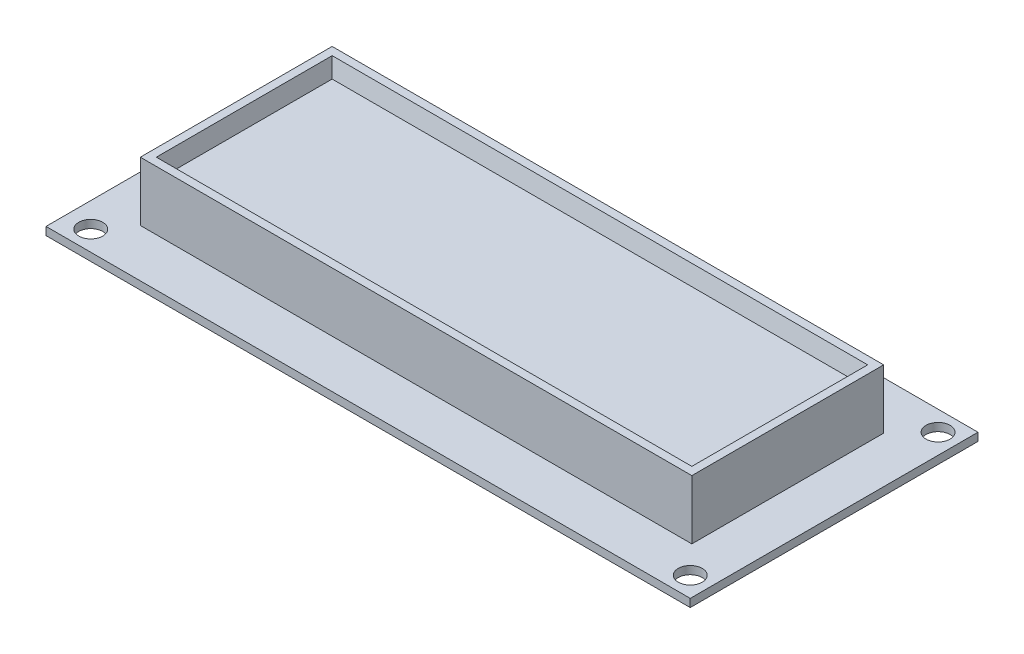
ISO-10303-21;
HEADER;
FILE_DESCRIPTION(('STEP AP214'),'2;1');
FILE_NAME('part.step','',(''),(''),'','','');
FILE_SCHEMA(('AUTOMOTIVE_DESIGN { 1 0 10303 214 1 1 1 1 }'));
ENDSEC;
DATA;
#1=APPLICATION_CONTEXT('core data for automotive mechanical design processes');
#2=APPLICATION_PROTOCOL_DEFINITION('international standard','automotive_design',2000,#1);
#3=PRODUCT_CONTEXT('',#1,'mechanical');
#4=PRODUCT('Part','Part','',(#3));
#5=PRODUCT_RELATED_PRODUCT_CATEGORY('part','',(#4));
#6=PRODUCT_DEFINITION_FORMATION('','',#4);
#7=PRODUCT_DEFINITION_CONTEXT('part definition',#1,'design');
#8=PRODUCT_DEFINITION('design','',#6,#7);
#9=PRODUCT_DEFINITION_SHAPE('','',#8);
#10=(LENGTH_UNIT() NAMED_UNIT(*) SI_UNIT(.MILLI.,.METRE.));
#11=(NAMED_UNIT(*) PLANE_ANGLE_UNIT() SI_UNIT($,.RADIAN.));
#12=(NAMED_UNIT(*) SI_UNIT($,.STERADIAN.) SOLID_ANGLE_UNIT());
#13=UNCERTAINTY_MEASURE_WITH_UNIT(LENGTH_MEASURE(1.E-05),#10,'distance_accuracy_value','');
#14=(GEOMETRIC_REPRESENTATION_CONTEXT(3) GLOBAL_UNCERTAINTY_ASSIGNED_CONTEXT((#13)) GLOBAL_UNIT_ASSIGNED_CONTEXT((#10,
#11,#12)) REPRESENTATION_CONTEXT('',''));
#15=CARTESIAN_POINT('',(0.,0.,0.));
#16=DIRECTION('',(0.,0.,1.));
#17=DIRECTION('',(1.,0.,0.));
#18=AXIS2_PLACEMENT_3D('',#15,#16,#17);
#19=CARTESIAN_POINT('',(0.,1.,0.));
#20=DIRECTION('',(0.,-1.,0.));
#21=DIRECTION('',(0.,0.,-1.));
#22=AXIS2_PLACEMENT_3D('',#19,#20,#21);
#23=PLANE('',#22);
#24=CARTESIAN_POINT('',(78.1,1.,-33.5));
#25=DIRECTION('',(0.,1.,0.));
#26=DIRECTION('',(0.,0.,1.));
#27=AXIS2_PLACEMENT_3D('',#24,#25,#26);
#28=CIRCLE('',#27,1.5);
#29=CARTESIAN_POINT('',(78.1,1.,-32.));
#30=VERTEX_POINT('',#29);
#31=EDGE_CURVE('E155',#30,#30,#28,.T.);
#32=ORIENTED_EDGE('',*,*,#31,.F.);
#33=EDGE_LOOP('',(#32));
#34=FACE_BOUND('',#33,.T.);
#35=CARTESIAN_POINT('',(78.1,1.,-2.5));
#36=DIRECTION('',(0.,1.,0.));
#37=DIRECTION('',(0.,0.,1.));
#38=AXIS2_PLACEMENT_3D('',#35,#36,#37);
#39=CIRCLE('',#38,1.5);
#40=CARTESIAN_POINT('',(78.1,1.,-0.999999999999998));
#41=VERTEX_POINT('',#40);
#42=EDGE_CURVE('E170',#41,#41,#39,.T.);
#43=ORIENTED_EDGE('',*,*,#42,.F.);
#44=EDGE_LOOP('',(#43));
#45=FACE_BOUND('',#44,.T.);
#46=CARTESIAN_POINT('',(3.09999999999999,1.,-2.5));
#47=DIRECTION('',(0.,1.,0.));
#48=DIRECTION('',(0.,0.,1.));
#49=AXIS2_PLACEMENT_3D('',#46,#47,#48);
#50=CIRCLE('',#49,1.5);
#51=CARTESIAN_POINT('',(3.09999999999999,1.,-0.999999999999996));
#52=VERTEX_POINT('',#51);
#53=EDGE_CURVE('E166',#52,#52,#50,.T.);
#54=ORIENTED_EDGE('',*,*,#53,.F.);
#55=EDGE_LOOP('',(#54));
#56=FACE_BOUND('',#55,.T.);
#57=CARTESIAN_POINT('',(3.09999999999999,1.,-33.5));
#58=DIRECTION('',(0.,1.,0.));
#59=DIRECTION('',(0.,0.,1.));
#60=AXIS2_PLACEMENT_3D('',#57,#58,#59);
#61=CIRCLE('',#60,1.5);
#62=CARTESIAN_POINT('',(3.09999999999999,1.,-32.));
#63=VERTEX_POINT('',#62);
#64=EDGE_CURVE('E169',#63,#63,#61,.T.);
#65=ORIENTED_EDGE('',*,*,#64,.F.);
#66=EDGE_LOOP('',(#65));
#67=FACE_BOUND('',#66,.T.);
#68=DIRECTION('',(0.,0.,1.));
#69=VECTOR('',#68,1.);
#70=CARTESIAN_POINT('',(0.,1.,0.));
#71=LINE('',#70,#69);
#72=CARTESIAN_POINT('',(0.,1.,-36.));
#73=VERTEX_POINT('',#72);
#74=CARTESIAN_POINT('',(0.,1.,0.));
#75=VERTEX_POINT('',#74);
#76=EDGE_CURVE('E209',#73,#75,#71,.T.);
#77=ORIENTED_EDGE('',*,*,#76,.T.);
#78=DIRECTION('',(1.,0.,0.));
#79=VECTOR('',#78,1.);
#80=CARTESIAN_POINT('',(0.,1.,0.));
#81=LINE('',#80,#79);
#82=CARTESIAN_POINT('',(80.6,1.,0.));
#83=VERTEX_POINT('',#82);
#84=EDGE_CURVE('E212',#75,#83,#81,.T.);
#85=ORIENTED_EDGE('',*,*,#84,.T.);
#86=DIRECTION('',(0.,0.,-1.));
#87=VECTOR('',#86,1.);
#88=CARTESIAN_POINT('',(80.6,1.,0.));
#89=LINE('',#88,#87);
#90=CARTESIAN_POINT('',(80.6,1.,-36.));
#91=VERTEX_POINT('',#90);
#92=EDGE_CURVE('E215',#83,#91,#89,.T.);
#93=ORIENTED_EDGE('',*,*,#92,.T.);
#94=DIRECTION('',(-1.,0.,0.));
#95=VECTOR('',#94,1.);
#96=CARTESIAN_POINT('',(0.,1.,-36.));
#97=LINE('',#96,#95);
#98=EDGE_CURVE('E217',#91,#73,#97,.T.);
#99=ORIENTED_EDGE('',*,*,#98,.T.);
#100=EDGE_LOOP('',(#77,#85,#93,#99));
#101=FACE_BOUND('',#100,.T.);
#102=DIRECTION('',(0.,0.,1.));
#103=VECTOR('',#102,1.);
#104=CARTESIAN_POINT('',(5.8,1.,-6.));
#105=LINE('',#104,#103);
#106=CARTESIAN_POINT('',(5.8,1.,-30.));
#107=VERTEX_POINT('',#106);
#108=CARTESIAN_POINT('',(5.8,1.,-6.));
#109=VERTEX_POINT('',#108);
#110=EDGE_CURVE('E59',#107,#109,#105,.T.);
#111=ORIENTED_EDGE('',*,*,#110,.F.);
#112=DIRECTION('',(-1.,0.,0.));
#113=VECTOR('',#112,1.);
#114=CARTESIAN_POINT('',(5.8,1.,-30.));
#115=LINE('',#114,#113);
#116=CARTESIAN_POINT('',(74.8,1.,-30.));
#117=VERTEX_POINT('',#116);
#118=EDGE_CURVE('E182',#117,#107,#115,.T.);
#119=ORIENTED_EDGE('',*,*,#118,.F.);
#120=DIRECTION('',(0.,0.,-1.));
#121=VECTOR('',#120,1.);
#122=CARTESIAN_POINT('',(74.8,1.,-6.));
#123=LINE('',#122,#121);
#124=CARTESIAN_POINT('',(74.8,1.,-6.));
#125=VERTEX_POINT('',#124);
#126=EDGE_CURVE('E193',#125,#117,#123,.T.);
#127=ORIENTED_EDGE('',*,*,#126,.F.);
#128=DIRECTION('',(1.,0.,0.));
#129=VECTOR('',#128,1.);
#130=CARTESIAN_POINT('',(5.8,1.,-6.));
#131=LINE('',#130,#129);
#132=EDGE_CURVE('E190',#109,#125,#131,.T.);
#133=ORIENTED_EDGE('',*,*,#132,.F.);
#134=EDGE_LOOP('',(#111,#119,#127,#133));
#135=FACE_BOUND('',#134,.T.);
#136=ADVANCED_FACE('F34',(#34,#45,#56,#67,#101,#135),#23,.F.);
#137=CARTESIAN_POINT('',(0.,1.,0.));
#138=DIRECTION('',(1.,0.,0.));
#139=DIRECTION('',(0.,0.,-1.));
#140=AXIS2_PLACEMENT_3D('',#137,#138,#139);
#141=PLANE('',#140);
#142=DIRECTION('',(0.,0.,1.));
#143=VECTOR('',#142,1.);
#144=CARTESIAN_POINT('',(0.,0.,0.));
#145=LINE('',#144,#143);
#146=CARTESIAN_POINT('',(0.,0.,-36.));
#147=VERTEX_POINT('',#146);
#148=CARTESIAN_POINT('',(0.,0.,0.));
#149=VERTEX_POINT('',#148);
#150=EDGE_CURVE('E208',#147,#149,#145,.T.);
#151=ORIENTED_EDGE('',*,*,#150,.T.);
#152=DIRECTION('',(0.,-1.,0.));
#153=VECTOR('',#152,1.);
#154=CARTESIAN_POINT('',(0.,1.,0.));
#155=LINE('',#154,#153);
#156=EDGE_CURVE('E11',#75,#149,#155,.T.);
#157=ORIENTED_EDGE('',*,*,#156,.F.);
#158=ORIENTED_EDGE('',*,*,#76,.F.);
#159=DIRECTION('',(0.,-1.,0.));
#160=VECTOR('',#159,1.);
#161=CARTESIAN_POINT('',(0.,1.,-36.));
#162=LINE('',#161,#160);
#163=EDGE_CURVE('E219',#73,#147,#162,.T.);
#164=ORIENTED_EDGE('',*,*,#163,.T.);
#165=EDGE_LOOP('',(#151,#157,#158,#164));
#166=FACE_BOUND('',#165,.T.);
#167=ADVANCED_FACE('F36',(#166),#141,.F.);
#168=CARTESIAN_POINT('',(0.,1.,0.));
#169=DIRECTION('',(0.,0.,-1.));
#170=DIRECTION('',(-1.,0.,0.));
#171=AXIS2_PLACEMENT_3D('',#168,#169,#170);
#172=PLANE('',#171);
#173=DIRECTION('',(1.,0.,0.));
#174=VECTOR('',#173,1.);
#175=CARTESIAN_POINT('',(0.,0.,0.));
#176=LINE('',#175,#174);
#177=CARTESIAN_POINT('',(80.6,0.,0.));
#178=VERTEX_POINT('',#177);
#179=EDGE_CURVE('E222',#149,#178,#176,.T.);
#180=ORIENTED_EDGE('',*,*,#179,.T.);
#181=DIRECTION('',(0.,-1.,0.));
#182=VECTOR('',#181,1.);
#183=CARTESIAN_POINT('',(80.6,1.,0.));
#184=LINE('',#183,#182);
#185=EDGE_CURVE('E43',#83,#178,#184,.T.);
#186=ORIENTED_EDGE('',*,*,#185,.F.);
#187=ORIENTED_EDGE('',*,*,#84,.F.);
#188=ORIENTED_EDGE('',*,*,#156,.T.);
#189=EDGE_LOOP('',(#180,#186,#187,#188));
#190=FACE_BOUND('',#189,.T.);
#191=ADVANCED_FACE('F274',(#190),#172,.F.);
#192=CARTESIAN_POINT('',(80.6,1.,0.));
#193=DIRECTION('',(-1.,0.,0.));
#194=DIRECTION('',(0.,0.,1.));
#195=AXIS2_PLACEMENT_3D('',#192,#193,#194);
#196=PLANE('',#195);
#197=DIRECTION('',(0.,0.,-1.));
#198=VECTOR('',#197,1.);
#199=CARTESIAN_POINT('',(80.6,0.,0.));
#200=LINE('',#199,#198);
#201=CARTESIAN_POINT('',(80.6,0.,-36.));
#202=VERTEX_POINT('',#201);
#203=EDGE_CURVE('E224',#178,#202,#200,.T.);
#204=ORIENTED_EDGE('',*,*,#203,.T.);
#205=DIRECTION('',(0.,-1.,0.));
#206=VECTOR('',#205,1.);
#207=CARTESIAN_POINT('',(80.6,1.,-36.));
#208=LINE('',#207,#206);
#209=EDGE_CURVE('E229',#91,#202,#208,.T.);
#210=ORIENTED_EDGE('',*,*,#209,.F.);
#211=ORIENTED_EDGE('',*,*,#92,.F.);
#212=ORIENTED_EDGE('',*,*,#185,.T.);
#213=EDGE_LOOP('',(#204,#210,#211,#212));
#214=FACE_BOUND('',#213,.T.);
#215=ADVANCED_FACE('F271',(#214),#196,.F.);
#216=CARTESIAN_POINT('',(0.,1.,-36.));
#217=DIRECTION('',(0.,0.,1.));
#218=DIRECTION('',(1.,0.,0.));
#219=AXIS2_PLACEMENT_3D('',#216,#217,#218);
#220=PLANE('',#219);
#221=DIRECTION('',(-1.,0.,0.));
#222=VECTOR('',#221,1.);
#223=CARTESIAN_POINT('',(0.,0.,-36.));
#224=LINE('',#223,#222);
#225=EDGE_CURVE('E213',#202,#147,#224,.T.);
#226=ORIENTED_EDGE('',*,*,#225,.T.);
#227=ORIENTED_EDGE('',*,*,#163,.F.);
#228=ORIENTED_EDGE('',*,*,#98,.F.);
#229=ORIENTED_EDGE('',*,*,#209,.T.);
#230=EDGE_LOOP('',(#226,#227,#228,#229));
#231=FACE_BOUND('',#230,.T.);
#232=ADVANCED_FACE('F252',(#231),#220,.F.);
#233=CARTESIAN_POINT('',(0.,0.,0.));
#234=DIRECTION('',(0.,-1.,0.));
#235=DIRECTION('',(0.,0.,-1.));
#236=AXIS2_PLACEMENT_3D('',#233,#234,#235);
#237=PLANE('',#236);
#238=CARTESIAN_POINT('',(78.1,0.,-33.5));
#239=DIRECTION('',(0.,-1.,0.));
#240=DIRECTION('',(0.,0.,-1.));
#241=AXIS2_PLACEMENT_3D('',#238,#239,#240);
#242=CIRCLE('',#241,1.5);
#243=CARTESIAN_POINT('',(78.1,0.,-35.));
#244=VERTEX_POINT('',#243);
#245=EDGE_CURVE('E38',#244,#244,#242,.T.);
#246=ORIENTED_EDGE('',*,*,#245,.F.);
#247=EDGE_LOOP('',(#246));
#248=FACE_BOUND('',#247,.T.);
#249=CARTESIAN_POINT('',(78.1,0.,-2.5));
#250=DIRECTION('',(0.,-1.,0.));
#251=DIRECTION('',(0.,0.,-1.));
#252=AXIS2_PLACEMENT_3D('',#249,#250,#251);
#253=CIRCLE('',#252,1.5);
#254=CARTESIAN_POINT('',(78.1,0.,-3.99999999999999));
#255=VERTEX_POINT('',#254);
#256=EDGE_CURVE('E238',#255,#255,#253,.T.);
#257=ORIENTED_EDGE('',*,*,#256,.F.);
#258=EDGE_LOOP('',(#257));
#259=FACE_BOUND('',#258,.T.);
#260=CARTESIAN_POINT('',(3.09999999999999,0.,-2.5));
#261=DIRECTION('',(0.,-1.,0.));
#262=DIRECTION('',(0.,0.,-1.));
#263=AXIS2_PLACEMENT_3D('',#260,#261,#262);
#264=CIRCLE('',#263,1.5);
#265=CARTESIAN_POINT('',(3.09999999999999,0.,-3.99999999999999));
#266=VERTEX_POINT('',#265);
#267=EDGE_CURVE('E236',#266,#266,#264,.T.);
#268=ORIENTED_EDGE('',*,*,#267,.F.);
#269=EDGE_LOOP('',(#268));
#270=FACE_BOUND('',#269,.T.);
#271=CARTESIAN_POINT('',(3.09999999999999,0.,-33.5));
#272=DIRECTION('',(0.,-1.,0.));
#273=DIRECTION('',(0.,0.,-1.));
#274=AXIS2_PLACEMENT_3D('',#271,#272,#273);
#275=CIRCLE('',#274,1.5);
#276=CARTESIAN_POINT('',(3.09999999999999,0.,-35.));
#277=VERTEX_POINT('',#276);
#278=EDGE_CURVE('E177',#277,#277,#275,.T.);
#279=ORIENTED_EDGE('',*,*,#278,.F.);
#280=EDGE_LOOP('',(#279));
#281=FACE_BOUND('',#280,.T.);
#282=ORIENTED_EDGE('',*,*,#150,.F.);
#283=ORIENTED_EDGE('',*,*,#225,.F.);
#284=ORIENTED_EDGE('',*,*,#203,.F.);
#285=ORIENTED_EDGE('',*,*,#179,.F.);
#286=EDGE_LOOP('',(#282,#283,#284,#285));
#287=FACE_BOUND('',#286,.T.);
#288=ADVANCED_FACE('F248',(#248,#259,#270,#281,#287),#237,.T.);
#289=CARTESIAN_POINT('',(5.8,8.4,-6.));
#290=DIRECTION('',(1.,0.,0.));
#291=DIRECTION('',(0.,0.,-1.));
#292=AXIS2_PLACEMENT_3D('',#289,#290,#291);
#293=PLANE('',#292);
#294=ORIENTED_EDGE('',*,*,#110,.T.);
#295=DIRECTION('',(0.,-1.,0.));
#296=VECTOR('',#295,1.);
#297=CARTESIAN_POINT('',(5.8,8.4,-6.));
#298=LINE('',#297,#296);
#299=CARTESIAN_POINT('',(5.8,8.4,-6.));
#300=VERTEX_POINT('',#299);
#301=EDGE_CURVE('E205',#300,#109,#298,.T.);
#302=ORIENTED_EDGE('',*,*,#301,.F.);
#303=DIRECTION('',(0.,0.,1.));
#304=VECTOR('',#303,1.);
#305=CARTESIAN_POINT('',(5.8,8.4,-6.));
#306=LINE('',#305,#304);
#307=CARTESIAN_POINT('',(5.8,8.4,-30.));
#308=VERTEX_POINT('',#307);
#309=EDGE_CURVE('E178',#308,#300,#306,.T.);
#310=ORIENTED_EDGE('',*,*,#309,.F.);
#311=DIRECTION('',(0.,-1.,0.));
#312=VECTOR('',#311,1.);
#313=CARTESIAN_POINT('',(5.8,8.4,-30.));
#314=LINE('',#313,#312);
#315=EDGE_CURVE('E188',#308,#107,#314,.T.);
#316=ORIENTED_EDGE('',*,*,#315,.T.);
#317=EDGE_LOOP('',(#294,#302,#310,#316));
#318=FACE_BOUND('',#317,.T.);
#319=ADVANCED_FACE('F251',(#318),#293,.F.);
#320=CARTESIAN_POINT('',(5.8,8.4,-6.));
#321=DIRECTION('',(0.,0.,-1.));
#322=DIRECTION('',(-1.,0.,0.));
#323=AXIS2_PLACEMENT_3D('',#320,#321,#322);
#324=PLANE('',#323);
#325=ORIENTED_EDGE('',*,*,#132,.T.);
#326=DIRECTION('',(0.,-1.,0.));
#327=VECTOR('',#326,1.);
#328=CARTESIAN_POINT('',(74.8,8.4,-6.));
#329=LINE('',#328,#327);
#330=CARTESIAN_POINT('',(74.8,8.4,-6.));
#331=VERTEX_POINT('',#330);
#332=EDGE_CURVE('E202',#331,#125,#329,.T.);
#333=ORIENTED_EDGE('',*,*,#332,.F.);
#334=DIRECTION('',(1.,0.,0.));
#335=VECTOR('',#334,1.);
#336=CARTESIAN_POINT('',(5.8,8.4,-6.));
#337=LINE('',#336,#335);
#338=EDGE_CURVE('E181',#300,#331,#337,.T.);
#339=ORIENTED_EDGE('',*,*,#338,.F.);
#340=ORIENTED_EDGE('',*,*,#301,.T.);
#341=EDGE_LOOP('',(#325,#333,#339,#340));
#342=FACE_BOUND('',#341,.T.);
#343=ADVANCED_FACE('F314',(#342),#324,.F.);
#344=CARTESIAN_POINT('',(74.8,8.4,-6.));
#345=DIRECTION('',(-1.,0.,0.));
#346=DIRECTION('',(0.,0.,1.));
#347=AXIS2_PLACEMENT_3D('',#344,#345,#346);
#348=PLANE('',#347);
#349=ORIENTED_EDGE('',*,*,#126,.T.);
#350=DIRECTION('',(0.,-1.,0.));
#351=VECTOR('',#350,1.);
#352=CARTESIAN_POINT('',(74.8,8.4,-30.));
#353=LINE('',#352,#351);
#354=CARTESIAN_POINT('',(74.8,8.4,-30.));
#355=VERTEX_POINT('',#354);
#356=EDGE_CURVE('E199',#355,#117,#353,.T.);
#357=ORIENTED_EDGE('',*,*,#356,.F.);
#358=DIRECTION('',(0.,0.,-1.));
#359=VECTOR('',#358,1.);
#360=CARTESIAN_POINT('',(74.8,8.4,-6.));
#361=LINE('',#360,#359);
#362=EDGE_CURVE('E184',#331,#355,#361,.T.);
#363=ORIENTED_EDGE('',*,*,#362,.F.);
#364=ORIENTED_EDGE('',*,*,#332,.T.);
#365=EDGE_LOOP('',(#349,#357,#363,#364));
#366=FACE_BOUND('',#365,.T.);
#367=ADVANCED_FACE('F321',(#366),#348,.F.);
#368=CARTESIAN_POINT('',(5.8,8.4,-30.));
#369=DIRECTION('',(0.,0.,1.));
#370=DIRECTION('',(1.,0.,0.));
#371=AXIS2_PLACEMENT_3D('',#368,#369,#370);
#372=PLANE('',#371);
#373=ORIENTED_EDGE('',*,*,#118,.T.);
#374=ORIENTED_EDGE('',*,*,#315,.F.);
#375=DIRECTION('',(-1.,0.,0.));
#376=VECTOR('',#375,1.);
#377=CARTESIAN_POINT('',(5.8,8.4,-30.));
#378=LINE('',#377,#376);
#379=EDGE_CURVE('E186',#355,#308,#378,.T.);
#380=ORIENTED_EDGE('',*,*,#379,.F.);
#381=ORIENTED_EDGE('',*,*,#356,.T.);
#382=EDGE_LOOP('',(#373,#374,#380,#381));
#383=FACE_BOUND('',#382,.T.);
#384=ADVANCED_FACE('F328',(#383),#372,.F.);
#385=CARTESIAN_POINT('',(0.,8.4,0.));
#386=DIRECTION('',(0.,-1.,0.));
#387=DIRECTION('',(0.,0.,-1.));
#388=AXIS2_PLACEMENT_3D('',#385,#386,#387);
#389=PLANE('',#388);
#390=DIRECTION('',(1.,0.,0.));
#391=VECTOR('',#390,1.);
#392=CARTESIAN_POINT('',(6.8,8.4,-7.));
#393=LINE('',#392,#391);
#394=CARTESIAN_POINT('',(6.8,8.4,-7.));
#395=VERTEX_POINT('',#394);
#396=CARTESIAN_POINT('',(73.8,8.4,-7.));
#397=VERTEX_POINT('',#396);
#398=EDGE_CURVE('E140',#395,#397,#393,.T.);
#399=ORIENTED_EDGE('',*,*,#398,.F.);
#400=DIRECTION('',(0.,0.,1.));
#401=VECTOR('',#400,1.);
#402=CARTESIAN_POINT('',(6.8,8.4,-29.));
#403=LINE('',#402,#401);
#404=CARTESIAN_POINT('',(6.8,8.4,-29.));
#405=VERTEX_POINT('',#404);
#406=EDGE_CURVE('E51',#405,#395,#403,.T.);
#407=ORIENTED_EDGE('',*,*,#406,.F.);
#408=DIRECTION('',(-1.,0.,0.));
#409=VECTOR('',#408,1.);
#410=CARTESIAN_POINT('',(6.8,8.4,-29.));
#411=LINE('',#410,#409);
#412=CARTESIAN_POINT('',(73.8,8.4,-29.));
#413=VERTEX_POINT('',#412);
#414=EDGE_CURVE('E147',#413,#405,#411,.T.);
#415=ORIENTED_EDGE('',*,*,#414,.F.);
#416=DIRECTION('',(0.,0.,-1.));
#417=VECTOR('',#416,1.);
#418=CARTESIAN_POINT('',(73.8,8.4,-29.));
#419=LINE('',#418,#417);
#420=EDGE_CURVE('E129',#397,#413,#419,.T.);
#421=ORIENTED_EDGE('',*,*,#420,.F.);
#422=EDGE_LOOP('',(#399,#407,#415,#421));
#423=FACE_BOUND('',#422,.T.);
#424=ORIENTED_EDGE('',*,*,#309,.T.);
#425=ORIENTED_EDGE('',*,*,#338,.T.);
#426=ORIENTED_EDGE('',*,*,#362,.T.);
#427=ORIENTED_EDGE('',*,*,#379,.T.);
#428=EDGE_LOOP('',(#424,#425,#426,#427));
#429=FACE_BOUND('',#428,.T.);
#430=ADVANCED_FACE('F144',(#423,#429),#389,.F.);
#431=CARTESIAN_POINT('',(3.09999999999999,-6.4,-33.5));
#432=DIRECTION('',(0.,1.,0.));
#433=DIRECTION('',(0.,0.,1.));
#434=AXIS2_PLACEMENT_3D('',#431,#432,#433);
#435=CYLINDRICAL_SURFACE('',#434,1.5);
#436=ORIENTED_EDGE('',*,*,#278,.T.);
#437=EDGE_LOOP('',(#436));
#438=FACE_BOUND('',#437,.T.);
#439=ORIENTED_EDGE('',*,*,#64,.T.);
#440=EDGE_LOOP('',(#439));
#441=FACE_BOUND('',#440,.T.);
#442=ADVANCED_FACE('F343',(#438,#441),#435,.F.);
#443=CARTESIAN_POINT('',(3.09999999999999,-6.4,-2.5));
#444=DIRECTION('',(0.,1.,0.));
#445=DIRECTION('',(0.,0.,1.));
#446=AXIS2_PLACEMENT_3D('',#443,#444,#445);
#447=CYLINDRICAL_SURFACE('',#446,1.5);
#448=ORIENTED_EDGE('',*,*,#267,.T.);
#449=EDGE_LOOP('',(#448));
#450=FACE_BOUND('',#449,.T.);
#451=ORIENTED_EDGE('',*,*,#53,.T.);
#452=EDGE_LOOP('',(#451));
#453=FACE_BOUND('',#452,.T.);
#454=ADVANCED_FACE('F351',(#450,#453),#447,.F.);
#455=CARTESIAN_POINT('',(78.1,-6.4,-2.5));
#456=DIRECTION('',(0.,1.,0.));
#457=DIRECTION('',(0.,0.,1.));
#458=AXIS2_PLACEMENT_3D('',#455,#456,#457);
#459=CYLINDRICAL_SURFACE('',#458,1.5);
#460=ORIENTED_EDGE('',*,*,#256,.T.);
#461=EDGE_LOOP('',(#460));
#462=FACE_BOUND('',#461,.T.);
#463=ORIENTED_EDGE('',*,*,#42,.T.);
#464=EDGE_LOOP('',(#463));
#465=FACE_BOUND('',#464,.T.);
#466=ADVANCED_FACE('F359',(#462,#465),#459,.F.);
#467=CARTESIAN_POINT('',(78.1,-6.4,-33.5));
#468=DIRECTION('',(0.,1.,0.));
#469=DIRECTION('',(0.,0.,1.));
#470=AXIS2_PLACEMENT_3D('',#467,#468,#469);
#471=CYLINDRICAL_SURFACE('',#470,1.5);
#472=ORIENTED_EDGE('',*,*,#245,.T.);
#473=EDGE_LOOP('',(#472));
#474=FACE_BOUND('',#473,.T.);
#475=ORIENTED_EDGE('',*,*,#31,.T.);
#476=EDGE_LOOP('',(#475));
#477=FACE_BOUND('',#476,.T.);
#478=ADVANCED_FACE('F245',(#474,#477),#471,.F.);
#479=CARTESIAN_POINT('',(6.8,8.4,-29.));
#480=DIRECTION('',(-0.965925826289068,-0.258819045102521,0.));
#481=DIRECTION('',(0.258819045102521,-0.965925826289068,0.));
#482=AXIS2_PLACEMENT_3D('',#479,#480,#481);
#483=PLANE('',#482);
#484=ORIENTED_EDGE('',*,*,#406,.T.);
#485=DIRECTION('',(-0.250562807085732,0.935113126531029,0.250562807085732));
#486=VECTOR('',#485,1.);
#487=CARTESIAN_POINT('',(8.181197846483,3.24529946162075,-8.38119784648299));
#488=LINE('',#487,#486);
#489=CARTESIAN_POINT('',(7.33589838486225,6.4,-7.53589838486224));
#490=VERTEX_POINT('',#489);
#491=EDGE_CURVE('E137',#490,#395,#488,.T.);
#492=ORIENTED_EDGE('',*,*,#491,.F.);
#493=DIRECTION('',(0.,0.,1.));
#494=VECTOR('',#493,1.);
#495=CARTESIAN_POINT('',(7.33589838486225,6.4,0.));
#496=LINE('',#495,#494);
#497=CARTESIAN_POINT('',(7.33589838486224,6.4,-28.4641016151378));
#498=VERTEX_POINT('',#497);
#499=EDGE_CURVE('E149',#498,#490,#496,.T.);
#500=ORIENTED_EDGE('',*,*,#499,.F.);
#501=DIRECTION('',(-0.250562807085732,0.935113126531029,-0.250562807085732));
#502=VECTOR('',#501,1.);
#503=CARTESIAN_POINT('',(6.8,8.4,-29.));
#504=LINE('',#503,#502);
#505=EDGE_CURVE('E153',#498,#405,#504,.T.);
#506=ORIENTED_EDGE('',*,*,#505,.T.);
#507=EDGE_LOOP('',(#484,#492,#500,#506));
#508=FACE_BOUND('',#507,.T.);
#509=ADVANCED_FACE('F372',(#508),#483,.F.);
#510=CARTESIAN_POINT('',(6.8,8.4,-29.));
#511=DIRECTION('',(0.,-0.258819045102521,-0.965925826289068));
#512=DIRECTION('',(0.,0.965925826289068,-0.258819045102521));
#513=AXIS2_PLACEMENT_3D('',#510,#511,#512);
#514=PLANE('',#513);
#515=ORIENTED_EDGE('',*,*,#414,.T.);
#516=ORIENTED_EDGE('',*,*,#505,.F.);
#517=DIRECTION('',(-1.,0.,0.));
#518=VECTOR('',#517,1.);
#519=CARTESIAN_POINT('',(0.,6.4,-28.4641016151378));
#520=LINE('',#519,#518);
#521=CARTESIAN_POINT('',(73.2641016151378,6.4,-28.4641016151378));
#522=VERTEX_POINT('',#521);
#523=EDGE_CURVE('E156',#522,#498,#520,.T.);
#524=ORIENTED_EDGE('',*,*,#523,.F.);
#525=DIRECTION('',(0.250562807085732,0.935113126531029,-0.250562807085732));
#526=VECTOR('',#525,1.);
#527=CARTESIAN_POINT('',(73.8,8.4,-29.));
#528=LINE('',#527,#526);
#529=EDGE_CURVE('E136',#522,#413,#528,.T.);
#530=ORIENTED_EDGE('',*,*,#529,.T.);
#531=EDGE_LOOP('',(#515,#516,#524,#530));
#532=FACE_BOUND('',#531,.T.);
#533=ADVANCED_FACE('F378',(#532),#514,.F.);
#534=CARTESIAN_POINT('',(73.8,8.4,-29.));
#535=DIRECTION('',(0.965925826289068,-0.258819045102521,0.));
#536=DIRECTION('',(0.258819045102521,0.965925826289068,0.));
#537=AXIS2_PLACEMENT_3D('',#534,#535,#536);
#538=PLANE('',#537);
#539=ORIENTED_EDGE('',*,*,#420,.T.);
#540=ORIENTED_EDGE('',*,*,#529,.F.);
#541=DIRECTION('',(0.,0.,-1.));
#542=VECTOR('',#541,1.);
#543=CARTESIAN_POINT('',(73.2641016151378,6.4,0.));
#544=LINE('',#543,#542);
#545=CARTESIAN_POINT('',(73.2641016151378,6.4,-7.53589838486224));
#546=VERTEX_POINT('',#545);
#547=EDGE_CURVE('E132',#546,#522,#544,.T.);
#548=ORIENTED_EDGE('',*,*,#547,.F.);
#549=DIRECTION('',(0.250562807085732,0.935113126531029,0.250562807085732));
#550=VECTOR('',#549,1.);
#551=CARTESIAN_POINT('',(69.5936247402563,-7.29840618506409,-11.2063752597437));
#552=LINE('',#551,#550);
#553=EDGE_CURVE('E125',#546,#397,#552,.T.);
#554=ORIENTED_EDGE('',*,*,#553,.T.);
#555=EDGE_LOOP('',(#539,#540,#548,#554));
#556=FACE_BOUND('',#555,.T.);
#557=ADVANCED_FACE('F127',(#556),#538,.F.);
#558=CARTESIAN_POINT('',(6.8,8.4,-7.));
#559=DIRECTION('',(0.,-0.258819045102521,0.965925826289068));
#560=DIRECTION('',(0.,-0.965925826289068,-0.258819045102521));
#561=AXIS2_PLACEMENT_3D('',#558,#559,#560);
#562=PLANE('',#561);
#563=ORIENTED_EDGE('',*,*,#398,.T.);
#564=ORIENTED_EDGE('',*,*,#553,.F.);
#565=DIRECTION('',(1.,0.,0.));
#566=VECTOR('',#565,1.);
#567=CARTESIAN_POINT('',(0.,6.4,-7.53589838486224));
#568=LINE('',#567,#566);
#569=EDGE_CURVE('E161',#490,#546,#568,.T.);
#570=ORIENTED_EDGE('',*,*,#569,.F.);
#571=ORIENTED_EDGE('',*,*,#491,.T.);
#572=EDGE_LOOP('',(#563,#564,#570,#571));
#573=FACE_BOUND('',#572,.T.);
#574=ADVANCED_FACE('F141',(#573),#562,.F.);
#575=CARTESIAN_POINT('',(0.,6.4,0.));
#576=DIRECTION('',(0.,1.,0.));
#577=DIRECTION('',(0.,0.,1.));
#578=AXIS2_PLACEMENT_3D('',#575,#576,#577);
#579=PLANE('',#578);
#580=ORIENTED_EDGE('',*,*,#499,.T.);
#581=ORIENTED_EDGE('',*,*,#569,.T.);
#582=ORIENTED_EDGE('',*,*,#547,.T.);
#583=ORIENTED_EDGE('',*,*,#523,.T.);
#584=EDGE_LOOP('',(#580,#581,#582,#583));
#585=FACE_BOUND('',#584,.T.);
#586=ADVANCED_FACE('F398',(#585),#579,.T.);
#587=CLOSED_SHELL('',(#136,#167,#191,#215,#232,#288,#319,#343,#367,#384,#430,#442,#454,#466,
#478,#509,#533,#557,#574,#586));
#588=MANIFOLD_SOLID_BREP('B2',#587);
#589=ADVANCED_BREP_SHAPE_REPRESENTATION('',(#18,#588),#14);
#590=SHAPE_DEFINITION_REPRESENTATION(#9,#589);
ENDSEC;
END-ISO-10303-21;
